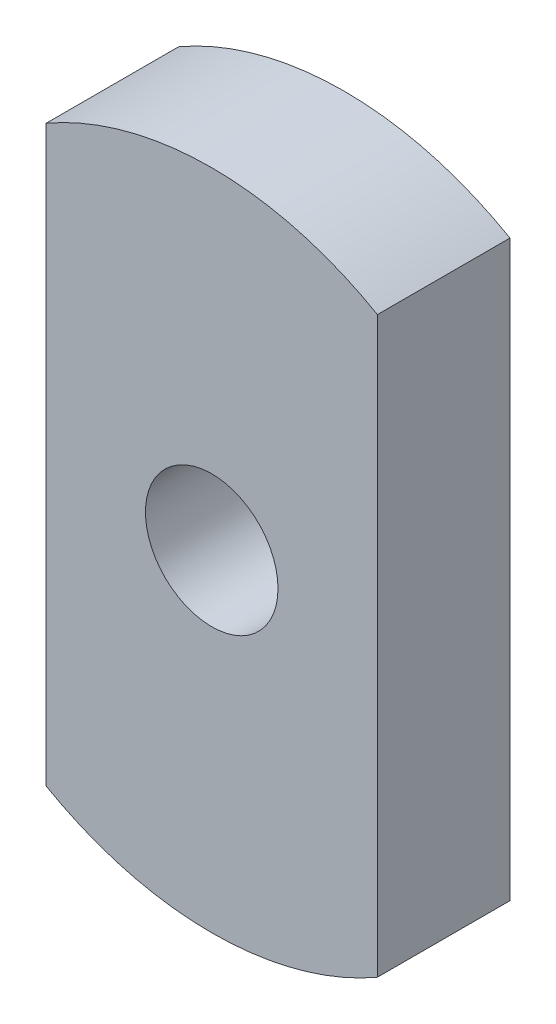
ISO-10303-21;
HEADER;
FILE_DESCRIPTION(('STEP AP214'),'2;1');
FILE_NAME('part.step','',(''),(''),'','','');
FILE_SCHEMA(('AUTOMOTIVE_DESIGN { 1 0 10303 214 1 1 1 1 }'));
ENDSEC;
DATA;
#1=APPLICATION_CONTEXT('core data for automotive mechanical design processes');
#2=APPLICATION_PROTOCOL_DEFINITION('international standard','automotive_design',2000,#1);
#3=PRODUCT_CONTEXT('',#1,'mechanical');
#4=PRODUCT('Part','Part','',(#3));
#5=PRODUCT_RELATED_PRODUCT_CATEGORY('part','',(#4));
#6=PRODUCT_DEFINITION_FORMATION('','',#4);
#7=PRODUCT_DEFINITION_CONTEXT('part definition',#1,'design');
#8=PRODUCT_DEFINITION('design','',#6,#7);
#9=PRODUCT_DEFINITION_SHAPE('','',#8);
#10=(LENGTH_UNIT() NAMED_UNIT(*) SI_UNIT(.MILLI.,.METRE.));
#11=(NAMED_UNIT(*) PLANE_ANGLE_UNIT() SI_UNIT($,.RADIAN.));
#12=(NAMED_UNIT(*) SI_UNIT($,.STERADIAN.) SOLID_ANGLE_UNIT());
#13=UNCERTAINTY_MEASURE_WITH_UNIT(LENGTH_MEASURE(1.E-05),#10,'distance_accuracy_value','');
#14=(GEOMETRIC_REPRESENTATION_CONTEXT(3) GLOBAL_UNCERTAINTY_ASSIGNED_CONTEXT((#13)) GLOBAL_UNIT_ASSIGNED_CONTEXT((#10,
#11,#12)) REPRESENTATION_CONTEXT('',''));
#15=CARTESIAN_POINT('',(0.,0.,0.));
#16=DIRECTION('',(0.,0.,1.));
#17=DIRECTION('',(1.,0.,0.));
#18=AXIS2_PLACEMENT_3D('',#15,#16,#17);
#19=CARTESIAN_POINT('',(0.,0.,4.));
#20=DIRECTION('',(0.,0.,-1.));
#21=DIRECTION('',(-1.,0.,0.));
#22=AXIS2_PLACEMENT_3D('',#19,#20,#21);
#23=PLANE('',#22);
#24=CARTESIAN_POINT('',(0.,0.,4.));
#25=DIRECTION('',(0.,0.,1.));
#26=DIRECTION('',(-1.,0.,0.));
#27=AXIS2_PLACEMENT_3D('',#24,#25,#26);
#28=CIRCLE('',#27,10.);
#29=CARTESIAN_POINT('',(5.,8.66025403784439,4.));
#30=VERTEX_POINT('',#29);
#31=CARTESIAN_POINT('',(-5.,8.66025403784439,4.));
#32=VERTEX_POINT('',#31);
#33=EDGE_CURVE('E84',#30,#32,#28,.T.);
#34=ORIENTED_EDGE('',*,*,#33,.T.);
#35=DIRECTION('',(0.,-1.,0.));
#36=VECTOR('',#35,1.);
#37=CARTESIAN_POINT('',(-5.,8.66025403784439,4.));
#38=LINE('',#37,#36);
#39=CARTESIAN_POINT('',(-5.,-8.66025403784439,4.));
#40=VERTEX_POINT('',#39);
#41=EDGE_CURVE('E79',#32,#40,#38,.T.);
#42=ORIENTED_EDGE('',*,*,#41,.T.);
#43=CARTESIAN_POINT('',(0.,0.,4.));
#44=DIRECTION('',(0.,0.,1.));
#45=DIRECTION('',(1.,0.,0.));
#46=AXIS2_PLACEMENT_3D('',#43,#44,#45);
#47=CIRCLE('',#46,10.);
#48=CARTESIAN_POINT('',(5.,-8.66025403784439,4.));
#49=VERTEX_POINT('',#48);
#50=EDGE_CURVE('E82',#40,#49,#47,.T.);
#51=ORIENTED_EDGE('',*,*,#50,.T.);
#52=DIRECTION('',(0.,1.,0.));
#53=VECTOR('',#52,1.);
#54=CARTESIAN_POINT('',(5.,8.66025403784439,4.));
#55=LINE('',#54,#53);
#56=EDGE_CURVE('E49',#49,#30,#55,.T.);
#57=ORIENTED_EDGE('',*,*,#56,.T.);
#58=EDGE_LOOP('',(#34,#42,#51,#57));
#59=FACE_BOUND('',#58,.T.);
#60=CARTESIAN_POINT('',(0.,0.,4.));
#61=DIRECTION('',(0.,0.,1.));
#62=DIRECTION('',(1.,0.,0.));
#63=AXIS2_PLACEMENT_3D('',#60,#61,#62);
#64=CIRCLE('',#63,2.);
#65=CARTESIAN_POINT('',(2.,0.,4.));
#66=VERTEX_POINT('',#65);
#67=EDGE_CURVE('E99',#66,#66,#64,.T.);
#68=ORIENTED_EDGE('',*,*,#67,.F.);
#69=EDGE_LOOP('',(#68));
#70=FACE_BOUND('',#69,.T.);
#71=ADVANCED_FACE('F32',(#59,#70),#23,.F.);
#72=CARTESIAN_POINT('',(0.,0.,0.));
#73=DIRECTION('',(0.,0.,-1.));
#74=DIRECTION('',(-1.,0.,0.));
#75=AXIS2_PLACEMENT_3D('',#72,#73,#74);
#76=PLANE('',#75);
#77=CARTESIAN_POINT('',(0.,0.,0.));
#78=DIRECTION('',(0.,0.,1.));
#79=DIRECTION('',(-1.,0.,0.));
#80=AXIS2_PLACEMENT_3D('',#77,#78,#79);
#81=CIRCLE('',#80,10.);
#82=CARTESIAN_POINT('',(5.,8.66025403784439,0.));
#83=VERTEX_POINT('',#82);
#84=CARTESIAN_POINT('',(-5.,8.66025403784439,0.));
#85=VERTEX_POINT('',#84);
#86=EDGE_CURVE('E96',#83,#85,#81,.T.);
#87=ORIENTED_EDGE('',*,*,#86,.F.);
#88=DIRECTION('',(0.,1.,0.));
#89=VECTOR('',#88,1.);
#90=CARTESIAN_POINT('',(5.,8.66025403784439,0.));
#91=LINE('',#90,#89);
#92=CARTESIAN_POINT('',(5.,-8.66025403784439,0.));
#93=VERTEX_POINT('',#92);
#94=EDGE_CURVE('E72',#93,#83,#91,.T.);
#95=ORIENTED_EDGE('',*,*,#94,.F.);
#96=CARTESIAN_POINT('',(0.,0.,0.));
#97=DIRECTION('',(0.,0.,1.));
#98=DIRECTION('',(1.,0.,0.));
#99=AXIS2_PLACEMENT_3D('',#96,#97,#98);
#100=CIRCLE('',#99,10.);
#101=CARTESIAN_POINT('',(-5.,-8.66025403784439,0.));
#102=VERTEX_POINT('',#101);
#103=EDGE_CURVE('E66',#102,#93,#100,.T.);
#104=ORIENTED_EDGE('',*,*,#103,.F.);
#105=DIRECTION('',(0.,-1.,0.));
#106=VECTOR('',#105,1.);
#107=CARTESIAN_POINT('',(-5.,8.66025403784439,0.));
#108=LINE('',#107,#106);
#109=EDGE_CURVE('E88',#85,#102,#108,.T.);
#110=ORIENTED_EDGE('',*,*,#109,.F.);
#111=EDGE_LOOP('',(#87,#95,#104,#110));
#112=FACE_BOUND('',#111,.T.);
#113=CARTESIAN_POINT('',(0.,0.,0.));
#114=DIRECTION('',(0.,0.,1.));
#115=DIRECTION('',(1.,0.,0.));
#116=AXIS2_PLACEMENT_3D('',#113,#114,#115);
#117=CIRCLE('',#116,2.);
#118=CARTESIAN_POINT('',(2.,0.,0.));
#119=VERTEX_POINT('',#118);
#120=EDGE_CURVE('E111',#119,#119,#117,.T.);
#121=ORIENTED_EDGE('',*,*,#120,.T.);
#122=EDGE_LOOP('',(#121));
#123=FACE_BOUND('',#122,.T.);
#124=ADVANCED_FACE('F107',(#112,#123),#76,.T.);
#125=CARTESIAN_POINT('',(0.,0.,4.));
#126=DIRECTION('',(0.,0.,-1.));
#127=DIRECTION('',(-1.,0.,0.));
#128=AXIS2_PLACEMENT_3D('',#125,#126,#127);
#129=CYLINDRICAL_SURFACE('',#128,10.);
#130=ORIENTED_EDGE('',*,*,#86,.T.);
#131=DIRECTION('',(0.,0.,-1.));
#132=VECTOR('',#131,1.);
#133=CARTESIAN_POINT('',(-5.,8.66025403784439,4.));
#134=LINE('',#133,#132);
#135=EDGE_CURVE('E11',#32,#85,#134,.T.);
#136=ORIENTED_EDGE('',*,*,#135,.F.);
#137=ORIENTED_EDGE('',*,*,#33,.F.);
#138=DIRECTION('',(0.,0.,-1.));
#139=VECTOR('',#138,1.);
#140=CARTESIAN_POINT('',(5.,8.66025403784439,4.));
#141=LINE('',#140,#139);
#142=EDGE_CURVE('E92',#30,#83,#141,.T.);
#143=ORIENTED_EDGE('',*,*,#142,.T.);
#144=EDGE_LOOP('',(#130,#136,#137,#143));
#145=FACE_BOUND('',#144,.T.);
#146=ADVANCED_FACE('F34',(#145),#129,.T.);
#147=CARTESIAN_POINT('',(-5.,8.66025403784439,4.));
#148=DIRECTION('',(1.,0.,0.));
#149=DIRECTION('',(0.,0.,-1.));
#150=AXIS2_PLACEMENT_3D('',#147,#148,#149);
#151=PLANE('',#150);
#152=ORIENTED_EDGE('',*,*,#109,.T.);
#153=DIRECTION('',(0.,0.,-1.));
#154=VECTOR('',#153,1.);
#155=CARTESIAN_POINT('',(-5.,-8.66025403784439,4.));
#156=LINE('',#155,#154);
#157=EDGE_CURVE('E41',#40,#102,#156,.T.);
#158=ORIENTED_EDGE('',*,*,#157,.F.);
#159=ORIENTED_EDGE('',*,*,#41,.F.);
#160=ORIENTED_EDGE('',*,*,#135,.T.);
#161=EDGE_LOOP('',(#152,#158,#159,#160));
#162=FACE_BOUND('',#161,.T.);
#163=ADVANCED_FACE('F87',(#162),#151,.F.);
#164=CARTESIAN_POINT('',(0.,0.,4.));
#165=DIRECTION('',(0.,0.,-1.));
#166=DIRECTION('',(-1.,0.,0.));
#167=AXIS2_PLACEMENT_3D('',#164,#165,#166);
#168=CYLINDRICAL_SURFACE('',#167,10.);
#169=ORIENTED_EDGE('',*,*,#103,.T.);
#170=DIRECTION('',(0.,0.,-1.));
#171=VECTOR('',#170,1.);
#172=CARTESIAN_POINT('',(5.,-8.66025403784439,4.));
#173=LINE('',#172,#171);
#174=EDGE_CURVE('E89',#49,#93,#173,.T.);
#175=ORIENTED_EDGE('',*,*,#174,.F.);
#176=ORIENTED_EDGE('',*,*,#50,.F.);
#177=ORIENTED_EDGE('',*,*,#157,.T.);
#178=EDGE_LOOP('',(#169,#175,#176,#177));
#179=FACE_BOUND('',#178,.T.);
#180=ADVANCED_FACE('F90',(#179),#168,.T.);
#181=CARTESIAN_POINT('',(5.,8.66025403784439,4.));
#182=DIRECTION('',(-1.,0.,0.));
#183=DIRECTION('',(0.,0.,1.));
#184=AXIS2_PLACEMENT_3D('',#181,#182,#183);
#185=PLANE('',#184);
#186=ORIENTED_EDGE('',*,*,#94,.T.);
#187=ORIENTED_EDGE('',*,*,#142,.F.);
#188=ORIENTED_EDGE('',*,*,#56,.F.);
#189=ORIENTED_EDGE('',*,*,#174,.T.);
#190=EDGE_LOOP('',(#186,#187,#188,#189));
#191=FACE_BOUND('',#190,.T.);
#192=ADVANCED_FACE('F104',(#191),#185,.F.);
#193=CARTESIAN_POINT('',(0.,0.,4.));
#194=DIRECTION('',(0.,0.,-1.));
#195=DIRECTION('',(-1.,0.,0.));
#196=AXIS2_PLACEMENT_3D('',#193,#194,#195);
#197=CYLINDRICAL_SURFACE('',#196,2.);
#198=ORIENTED_EDGE('',*,*,#67,.T.);
#199=EDGE_LOOP('',(#198));
#200=FACE_BOUND('',#199,.T.);
#201=ORIENTED_EDGE('',*,*,#120,.F.);
#202=EDGE_LOOP('',(#201));
#203=FACE_BOUND('',#202,.T.);
#204=ADVANCED_FACE('F117',(#200,#203),#197,.F.);
#205=CLOSED_SHELL('',(#71,#124,#146,#163,#180,#192,#204));
#206=MANIFOLD_SOLID_BREP('B2',#205);
#207=ADVANCED_BREP_SHAPE_REPRESENTATION('',(#18,#206),#14);
#208=SHAPE_DEFINITION_REPRESENTATION(#9,#207);
ENDSEC;
END-ISO-10303-21;
